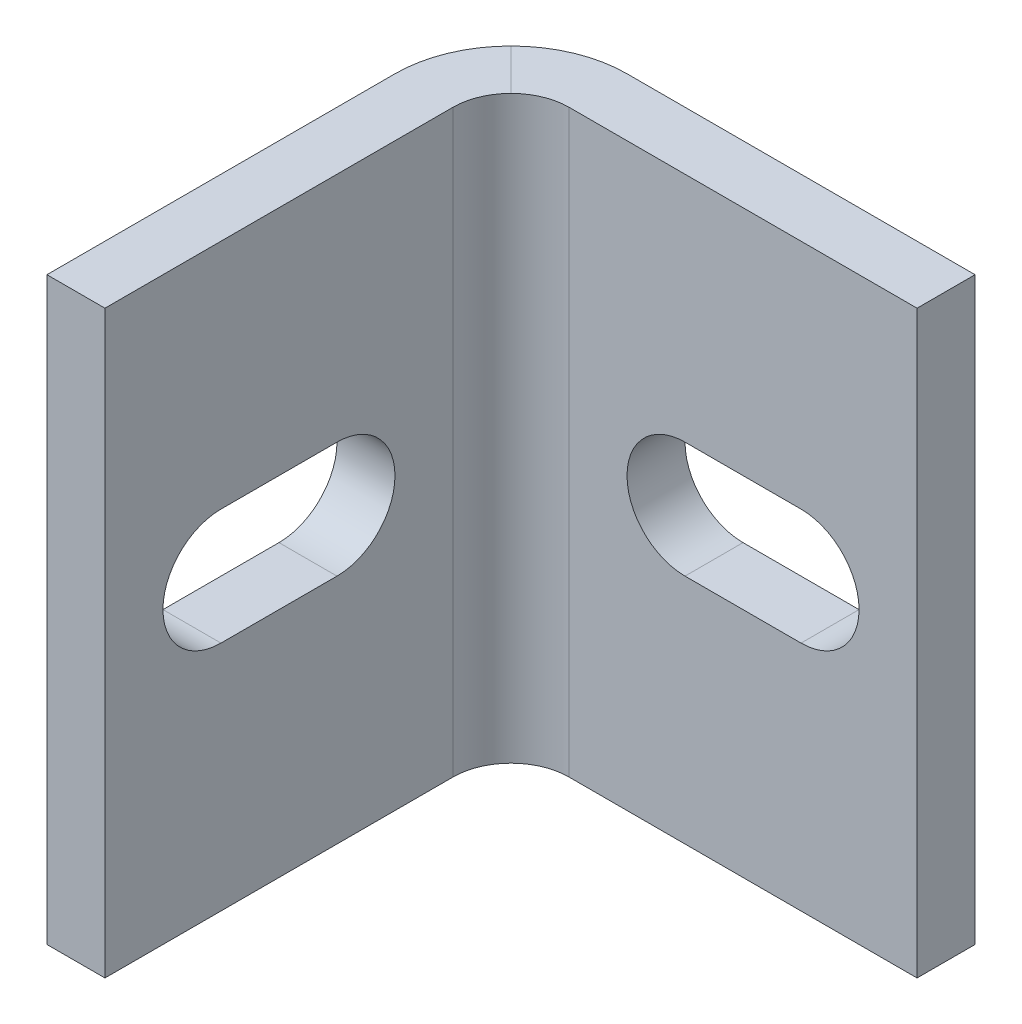
ISO-10303-21;
HEADER;
FILE_DESCRIPTION(('STEP AP214'),'2;1');
FILE_NAME('part.step','',(''),(''),'','','');
FILE_SCHEMA(('AUTOMOTIVE_DESIGN { 1 0 10303 214 1 1 1 1 }'));
ENDSEC;
DATA;
#1=APPLICATION_CONTEXT('core data for automotive mechanical design processes');
#2=APPLICATION_PROTOCOL_DEFINITION('international standard','automotive_design',2000,#1);
#3=PRODUCT_CONTEXT('',#1,'mechanical');
#4=PRODUCT('Part','Part','',(#3));
#5=PRODUCT_RELATED_PRODUCT_CATEGORY('part','',(#4));
#6=PRODUCT_DEFINITION_FORMATION('','',#4);
#7=PRODUCT_DEFINITION_CONTEXT('part definition',#1,'design');
#8=PRODUCT_DEFINITION('design','',#6,#7);
#9=PRODUCT_DEFINITION_SHAPE('','',#8);
#10=(LENGTH_UNIT() NAMED_UNIT(*) SI_UNIT(.MILLI.,.METRE.));
#11=(NAMED_UNIT(*) PLANE_ANGLE_UNIT() SI_UNIT($,.RADIAN.));
#12=(NAMED_UNIT(*) SI_UNIT($,.STERADIAN.) SOLID_ANGLE_UNIT());
#13=UNCERTAINTY_MEASURE_WITH_UNIT(LENGTH_MEASURE(1.E-05),#10,'distance_accuracy_value','');
#14=(GEOMETRIC_REPRESENTATION_CONTEXT(3) GLOBAL_UNCERTAINTY_ASSIGNED_CONTEXT((#13)) GLOBAL_UNIT_ASSIGNED_CONTEXT((#10,
#11,#12)) REPRESENTATION_CONTEXT('',''));
#15=CARTESIAN_POINT('',(0.,0.,0.));
#16=DIRECTION('',(0.,0.,1.));
#17=DIRECTION('',(1.,0.,0.));
#18=AXIS2_PLACEMENT_3D('',#15,#16,#17);
#19=CARTESIAN_POINT('',(0.,-15.875,0.));
#20=DIRECTION('',(1.,0.,0.));
#21=DIRECTION('',(0.,1.,0.));
#22=AXIS2_PLACEMENT_3D('',#19,#20,#21);
#23=PLANE('',#22);
#24=DIRECTION('',(0.,0.,-1.));
#25=VECTOR('',#24,1.);
#26=CARTESIAN_POINT('',(0.,15.875,0.));
#27=LINE('',#26,#25);
#28=CARTESIAN_POINT('',(0.,15.875,0.));
#29=VERTEX_POINT('',#28);
#30=CARTESIAN_POINT('',(-3.6949610038306E-13,15.875,-19.05));
#31=VERTEX_POINT('',#30);
#32=EDGE_CURVE('E236',#29,#31,#27,.T.);
#33=ORIENTED_EDGE('',*,*,#32,.T.);
#34=DIRECTION('',(0.,-1.,0.));
#35=VECTOR('',#34,1.);
#36=CARTESIAN_POINT('',(-3.64291929955129E-13,-15.875,-19.05));
#37=LINE('',#36,#35);
#38=CARTESIAN_POINT('',(-3.64291929955129E-13,-15.875,-19.05));
#39=VERTEX_POINT('',#38);
#40=EDGE_CURVE('E291',#31,#39,#37,.T.);
#41=ORIENTED_EDGE('',*,*,#40,.T.);
#42=DIRECTION('',(0.,0.,-1.));
#43=VECTOR('',#42,1.);
#44=CARTESIAN_POINT('',(0.,-15.875,0.));
#45=LINE('',#44,#43);
#46=CARTESIAN_POINT('',(0.,-15.875,0.));
#47=VERTEX_POINT('',#46);
#48=EDGE_CURVE('E233',#47,#39,#45,.T.);
#49=ORIENTED_EDGE('',*,*,#48,.F.);
#50=DIRECTION('',(0.,-1.,0.));
#51=VECTOR('',#50,1.);
#52=CARTESIAN_POINT('',(0.,-15.875,0.));
#53=LINE('',#52,#51);
#54=EDGE_CURVE('E231',#29,#47,#53,.T.);
#55=ORIENTED_EDGE('',*,*,#54,.F.);
#56=EDGE_LOOP('',(#33,#41,#49,#55));
#57=FACE_BOUND('',#56,.T.);
#58=CARTESIAN_POINT('',(-2.18575157973078E-13,0.,-12.7));
#59=DIRECTION('',(1.,0.,0.));
#60=DIRECTION('',(0.,0.,-1.));
#61=AXIS2_PLACEMENT_3D('',#58,#59,#60);
#62=CIRCLE('',#61,3.175);
#63=CARTESIAN_POINT('',(-2.32452945780892E-13,-3.17500000000001,-12.7));
#64=VERTEX_POINT('',#63);
#65=CARTESIAN_POINT('',(-2.18575157973078E-13,3.17499999999998,-12.7));
#66=VERTEX_POINT('',#65);
#67=EDGE_CURVE('E203',#64,#66,#62,.T.);
#68=ORIENTED_EDGE('',*,*,#67,.T.);
#69=DIRECTION('',(0.,0.,1.));
#70=VECTOR('',#69,1.);
#71=CARTESIAN_POINT('',(-2.18575157973078E-13,3.17499999999998,-12.7));
#72=LINE('',#71,#70);
#73=CARTESIAN_POINT('',(-1.21430643318376E-13,3.17499999999998,-6.35));
#74=VERTEX_POINT('',#73);
#75=EDGE_CURVE('E206',#66,#74,#72,.T.);
#76=ORIENTED_EDGE('',*,*,#75,.T.);
#77=CARTESIAN_POINT('',(-1.33573707650214E-13,0.,-6.35));
#78=DIRECTION('',(1.,0.,0.));
#79=DIRECTION('',(0.,0.,-1.));
#80=AXIS2_PLACEMENT_3D('',#77,#78,#79);
#81=CIRCLE('',#80,3.175);
#82=CARTESIAN_POINT('',(0.,-3.17500000000001,-6.35));
#83=VERTEX_POINT('',#82);
#84=EDGE_CURVE('E209',#74,#83,#81,.T.);
#85=ORIENTED_EDGE('',*,*,#84,.T.);
#86=DIRECTION('',(0.,0.,-1.));
#87=VECTOR('',#86,1.);
#88=CARTESIAN_POINT('',(-2.30718222304915E-13,-3.17500000000001,-12.7));
#89=LINE('',#88,#87);
#90=EDGE_CURVE('E212',#83,#64,#89,.T.);
#91=ORIENTED_EDGE('',*,*,#90,.T.);
#92=EDGE_LOOP('',(#68,#76,#85,#91));
#93=FACE_BOUND('',#92,.T.);
#94=ADVANCED_FACE('F34',(#57,#93),#23,.F.);
#95=CARTESIAN_POINT('',(3.175,-15.875,1.94289029309402E-13));
#96=DIRECTION('',(-1.,0.,0.));
#97=DIRECTION('',(0.,-1.,0.));
#98=AXIS2_PLACEMENT_3D('',#95,#96,#97);
#99=PLANE('',#98);
#100=DIRECTION('',(0.,0.,-1.));
#101=VECTOR('',#100,1.);
#102=CARTESIAN_POINT('',(3.175,-15.875,1.94289029309402E-13));
#103=LINE('',#102,#101);
#104=CARTESIAN_POINT('',(3.175,-15.875,1.94289029309402E-13));
#105=VERTEX_POINT('',#104);
#106=CARTESIAN_POINT('',(3.17499999999964,-15.875,-19.0499999999999));
#107=VERTEX_POINT('',#106);
#108=EDGE_CURVE('E232',#105,#107,#103,.T.);
#109=ORIENTED_EDGE('',*,*,#108,.T.);
#110=DIRECTION('',(0.,-1.,0.));
#111=VECTOR('',#110,1.);
#112=CARTESIAN_POINT('',(3.17499999999963,15.875,-19.0499999999999));
#113=LINE('',#112,#111);
#114=CARTESIAN_POINT('',(3.17499999999963,15.875,-19.0499999999999));
#115=VERTEX_POINT('',#114);
#116=EDGE_CURVE('E279',#107,#115,#113,.F.);
#117=ORIENTED_EDGE('',*,*,#116,.T.);
#118=DIRECTION('',(0.,0.,-1.));
#119=VECTOR('',#118,1.);
#120=CARTESIAN_POINT('',(3.17500000000001,15.875,1.94289029309402E-13));
#121=LINE('',#120,#119);
#122=CARTESIAN_POINT('',(3.17500000000001,15.875,1.94289029309402E-13));
#123=VERTEX_POINT('',#122);
#124=EDGE_CURVE('E243',#123,#115,#121,.T.);
#125=ORIENTED_EDGE('',*,*,#124,.F.);
#126=DIRECTION('',(0.,1.,0.));
#127=VECTOR('',#126,1.);
#128=CARTESIAN_POINT('',(3.175,-15.875,1.94289029309402E-13));
#129=LINE('',#128,#127);
#130=EDGE_CURVE('E246',#105,#123,#129,.T.);
#131=ORIENTED_EDGE('',*,*,#130,.F.);
#132=EDGE_LOOP('',(#109,#117,#125,#131));
#133=FACE_BOUND('',#132,.T.);
#134=CARTESIAN_POINT('',(3.17499999999978,0.,-12.7));
#135=DIRECTION('',(-1.,0.,0.));
#136=DIRECTION('',(0.,-1.,0.));
#137=AXIS2_PLACEMENT_3D('',#134,#135,#136);
#138=CIRCLE('',#137,3.175);
#139=CARTESIAN_POINT('',(3.17499999999973,3.17500000000001,-12.7));
#140=VERTEX_POINT('',#139);
#141=CARTESIAN_POINT('',(3.17499999999977,-3.17500000000001,-12.7));
#142=VERTEX_POINT('',#141);
#143=EDGE_CURVE('E200',#140,#142,#138,.T.);
#144=ORIENTED_EDGE('',*,*,#143,.T.);
#145=DIRECTION('',(0.,0.,1.));
#146=VECTOR('',#145,1.);
#147=CARTESIAN_POINT('',(3.17499999999977,-3.17500000000001,-12.7));
#148=LINE('',#147,#146);
#149=CARTESIAN_POINT('',(3.1749999999999,-3.17500000000001,-6.34999999999981));
#150=VERTEX_POINT('',#149);
#151=EDGE_CURVE('E224',#142,#150,#148,.T.);
#152=ORIENTED_EDGE('',*,*,#151,.T.);
#153=CARTESIAN_POINT('',(3.1749999999999,0.,-6.34999999999981));
#154=DIRECTION('',(-1.,0.,0.));
#155=DIRECTION('',(0.,-1.,0.));
#156=AXIS2_PLACEMENT_3D('',#153,#154,#155);
#157=CIRCLE('',#156,3.175);
#158=CARTESIAN_POINT('',(3.17499999999988,3.17499999999998,-6.34999999999981));
#159=VERTEX_POINT('',#158);
#160=EDGE_CURVE('E191',#150,#159,#157,.T.);
#161=ORIENTED_EDGE('',*,*,#160,.T.);
#162=DIRECTION('',(0.,0.,-1.));
#163=VECTOR('',#162,1.);
#164=CARTESIAN_POINT('',(3.17499999999973,3.17500000000001,-12.7));
#165=LINE('',#164,#163);
#166=EDGE_CURVE('E197',#159,#140,#165,.T.);
#167=ORIENTED_EDGE('',*,*,#166,.T.);
#168=EDGE_LOOP('',(#144,#152,#161,#167));
#169=FACE_BOUND('',#168,.T.);
#170=ADVANCED_FACE('F342',(#133,#169),#99,.F.);
#171=CARTESIAN_POINT('',(25.3999999999996,0.,-25.3999999999994));
#172=DIRECTION('',(-1.,0.,0.));
#173=DIRECTION('',(0.,0.,1.));
#174=AXIS2_PLACEMENT_3D('',#171,#172,#173);
#175=PLANE('',#174);
#176=DIRECTION('',(0.,1.,0.));
#177=VECTOR('',#176,1.);
#178=CARTESIAN_POINT('',(25.3999999999996,-15.875,-22.2249999999994));
#179=LINE('',#178,#177);
#180=CARTESIAN_POINT('',(25.3999999999996,-15.875,-22.2249999999994));
#181=VERTEX_POINT('',#180);
#182=CARTESIAN_POINT('',(25.3999999999996,15.875,-22.2249999999994));
#183=VERTEX_POINT('',#182);
#184=EDGE_CURVE('E272',#181,#183,#179,.T.);
#185=ORIENTED_EDGE('',*,*,#184,.F.);
#186=DIRECTION('',(0.,0.,1.));
#187=VECTOR('',#186,1.);
#188=CARTESIAN_POINT('',(25.3999999999996,-15.875,-22.2249999999994));
#189=LINE('',#188,#187);
#190=CARTESIAN_POINT('',(25.3999999999996,-15.875,-25.3999999999994));
#191=VERTEX_POINT('',#190);
#192=EDGE_CURVE('E227',#191,#181,#189,.T.);
#193=ORIENTED_EDGE('',*,*,#192,.F.);
#194=DIRECTION('',(0.,-1.,0.));
#195=VECTOR('',#194,1.);
#196=CARTESIAN_POINT('',(25.3999999999996,-15.875,-25.3999999999994));
#197=LINE('',#196,#195);
#198=CARTESIAN_POINT('',(25.3999999999995,15.875,-25.3999999999994));
#199=VERTEX_POINT('',#198);
#200=EDGE_CURVE('E263',#199,#191,#197,.T.);
#201=ORIENTED_EDGE('',*,*,#200,.F.);
#202=DIRECTION('',(0.,0.,-1.));
#203=VECTOR('',#202,1.);
#204=CARTESIAN_POINT('',(25.3999999999996,15.875,-22.2249999999994));
#205=LINE('',#204,#203);
#206=EDGE_CURVE('E268',#183,#199,#205,.T.);
#207=ORIENTED_EDGE('',*,*,#206,.F.);
#208=EDGE_LOOP('',(#185,#193,#201,#207));
#209=FACE_BOUND('',#208,.T.);
#210=ADVANCED_FACE('F338',(#209),#175,.F.);
#211=CARTESIAN_POINT('',(0.,0.,0.));
#212=DIRECTION('',(0.,0.,1.));
#213=DIRECTION('',(1.,0.,0.));
#214=AXIS2_PLACEMENT_3D('',#211,#212,#213);
#215=PLANE('',#214);
#216=ORIENTED_EDGE('',*,*,#130,.T.);
#217=DIRECTION('',(-1.,0.,0.));
#218=VECTOR('',#217,1.);
#219=CARTESIAN_POINT('',(3.17500000000001,15.875,1.94289029309402E-13));
#220=LINE('',#219,#218);
#221=EDGE_CURVE('E240',#123,#29,#220,.T.);
#222=ORIENTED_EDGE('',*,*,#221,.T.);
#223=ORIENTED_EDGE('',*,*,#54,.T.);
#224=DIRECTION('',(1.,0.,0.));
#225=VECTOR('',#224,1.);
#226=CARTESIAN_POINT('',(3.175,-15.875,1.94289029309402E-13));
#227=LINE('',#226,#225);
#228=EDGE_CURVE('E228',#47,#105,#227,.T.);
#229=ORIENTED_EDGE('',*,*,#228,.T.);
#230=EDGE_LOOP('',(#216,#222,#223,#229));
#231=FACE_BOUND('',#230,.T.);
#232=ADVANCED_FACE('F321',(#231),#215,.T.);
#233=CARTESIAN_POINT('',(-3.88578058618805E-13,-15.875,-22.225));
#234=DIRECTION('',(0.,0.,-1.));
#235=DIRECTION('',(0.,1.,0.));
#236=AXIS2_PLACEMENT_3D('',#233,#234,#235);
#237=PLANE('',#236);
#238=DIRECTION('',(1.,0.,0.));
#239=VECTOR('',#238,1.);
#240=CARTESIAN_POINT('',(12.6999999999996,-3.17500000000001,-22.2249999999997));
#241=LINE('',#240,#239);
#242=CARTESIAN_POINT('',(12.6999999999996,-3.17500000000001,-22.2249999999997));
#243=VERTEX_POINT('',#242);
#244=CARTESIAN_POINT('',(19.0499999999996,-3.17499999999998,-22.2249999999996));
#245=VERTEX_POINT('',#244);
#246=EDGE_CURVE('E185',#243,#245,#241,.T.);
#247=ORIENTED_EDGE('',*,*,#246,.F.);
#248=CARTESIAN_POINT('',(12.6999999999996,0.,-22.2249999999997));
#249=DIRECTION('',(0.,0.,1.));
#250=DIRECTION('',(1.,0.,0.));
#251=AXIS2_PLACEMENT_3D('',#248,#249,#250);
#252=CIRCLE('',#251,3.175);
#253=CARTESIAN_POINT('',(12.6999999999996,3.17499999999998,-22.2249999999997));
#254=VERTEX_POINT('',#253);
#255=EDGE_CURVE('E49',#254,#243,#252,.T.);
#256=ORIENTED_EDGE('',*,*,#255,.F.);
#257=DIRECTION('',(-1.,0.,0.));
#258=VECTOR('',#257,1.);
#259=CARTESIAN_POINT('',(12.6999999999996,3.17499999999998,-22.2249999999997));
#260=LINE('',#259,#258);
#261=CARTESIAN_POINT('',(19.0499999999996,3.17499999999998,-22.2249999999996));
#262=VERTEX_POINT('',#261);
#263=EDGE_CURVE('E176',#262,#254,#260,.T.);
#264=ORIENTED_EDGE('',*,*,#263,.F.);
#265=CARTESIAN_POINT('',(19.0499999999996,0.,-22.2249999999996));
#266=DIRECTION('',(0.,0.,1.));
#267=DIRECTION('',(1.,0.,0.));
#268=AXIS2_PLACEMENT_3D('',#265,#266,#267);
#269=CIRCLE('',#268,3.175);
#270=EDGE_CURVE('E179',#245,#262,#269,.T.);
#271=ORIENTED_EDGE('',*,*,#270,.F.);
#272=EDGE_LOOP('',(#247,#256,#264,#271));
#273=FACE_BOUND('',#272,.T.);
#274=DIRECTION('',(1.,0.,0.));
#275=VECTOR('',#274,1.);
#276=CARTESIAN_POINT('',(-4.25007251614318E-13,15.875,-22.225));
#277=LINE('',#276,#275);
#278=CARTESIAN_POINT('',(6.34999999999959,15.875,-22.2249999999999));
#279=VERTEX_POINT('',#278);
#280=EDGE_CURVE('E271',#279,#183,#277,.T.);
#281=ORIENTED_EDGE('',*,*,#280,.F.);
#282=DIRECTION('',(0.,-1.,0.));
#283=VECTOR('',#282,1.);
#284=CARTESIAN_POINT('',(6.34999999999959,-15.875,-22.2249999999999));
#285=LINE('',#284,#283);
#286=CARTESIAN_POINT('',(6.34999999999959,-15.875,-22.2249999999999));
#287=VERTEX_POINT('',#286);
#288=EDGE_CURVE('E249',#279,#287,#285,.T.);
#289=ORIENTED_EDGE('',*,*,#288,.T.);
#290=DIRECTION('',(1.,0.,0.));
#291=VECTOR('',#290,1.);
#292=CARTESIAN_POINT('',(-3.88578058618805E-13,-15.875,-22.225));
#293=LINE('',#292,#291);
#294=EDGE_CURVE('E254',#287,#181,#293,.T.);
#295=ORIENTED_EDGE('',*,*,#294,.T.);
#296=ORIENTED_EDGE('',*,*,#184,.T.);
#297=EDGE_LOOP('',(#281,#289,#295,#296));
#298=FACE_BOUND('',#297,.T.);
#299=ADVANCED_FACE('F331',(#273,#298),#237,.F.);
#300=CARTESIAN_POINT('',(-4.25007251614318E-13,15.875,-22.225));
#301=DIRECTION('',(0.,-1.,0.));
#302=DIRECTION('',(0.,0.,-1.));
#303=AXIS2_PLACEMENT_3D('',#300,#301,#302);
#304=PLANE('',#303);
#305=DIRECTION('',(1.,0.,0.));
#306=VECTOR('',#305,1.);
#307=CARTESIAN_POINT('',(-4.97865637605344E-13,15.875,-25.4));
#308=LINE('',#307,#306);
#309=CARTESIAN_POINT('',(6.34999999999952,15.875,-25.3999999999999));
#310=VERTEX_POINT('',#309);
#311=EDGE_CURVE('E266',#310,#199,#308,.T.);
#312=ORIENTED_EDGE('',*,*,#311,.F.);
#313=CARTESIAN_POINT('',(6.34999999999964,15.875,-19.0499999999999));
#314=DIRECTION('',(0.,-1.,0.));
#315=DIRECTION('',(0.,0.,-1.));
#316=AXIS2_PLACEMENT_3D('',#313,#314,#315);
#317=CIRCLE('',#316,6.35);
#318=CARTESIAN_POINT('',(1.85987193946495,15.875,-23.5401280605345));
#319=VERTEX_POINT('',#318);
#320=EDGE_CURVE('E42',#310,#319,#317,.F.);
#321=ORIENTED_EDGE('',*,*,#320,.T.);
#322=DIRECTION('',(0.70710678118656,0.,0.70710678118656));
#323=VECTOR('',#322,1.);
#324=CARTESIAN_POINT('',(14.2874999999998,15.875,-11.1124999999998));
#325=LINE('',#324,#323);
#326=CARTESIAN_POINT('',(4.10493596973232,15.875,-21.2950640302671));
#327=VERTEX_POINT('',#326);
#328=EDGE_CURVE('E237',#319,#327,#325,.T.);
#329=ORIENTED_EDGE('',*,*,#328,.T.);
#330=CARTESIAN_POINT('',(6.34999999999964,15.875,-19.0499999999999));
#331=DIRECTION('',(0.,-1.,0.));
#332=DIRECTION('',(0.,0.,-1.));
#333=AXIS2_PLACEMENT_3D('',#330,#331,#332);
#334=CIRCLE('',#333,3.175);
#335=EDGE_CURVE('E289',#327,#279,#334,.T.);
#336=ORIENTED_EDGE('',*,*,#335,.T.);
#337=ORIENTED_EDGE('',*,*,#280,.T.);
#338=ORIENTED_EDGE('',*,*,#206,.T.);
#339=EDGE_LOOP('',(#312,#321,#329,#336,#337,#338));
#340=FACE_BOUND('',#339,.T.);
#341=ADVANCED_FACE('F303',(#340),#304,.F.);
#342=CARTESIAN_POINT('',(-4.61436444609831E-13,-15.875,-25.4));
#343=DIRECTION('',(0.,0.,1.));
#344=DIRECTION('',(0.,-1.,0.));
#345=AXIS2_PLACEMENT_3D('',#342,#343,#344);
#346=PLANE('',#345);
#347=DIRECTION('',(-1.,0.,0.));
#348=VECTOR('',#347,1.);
#349=CARTESIAN_POINT('',(12.6999999999996,3.17499999999998,-25.3999999999997));
#350=LINE('',#349,#348);
#351=CARTESIAN_POINT('',(19.0499999999996,3.17499999999998,-25.3999999999996));
#352=VERTEX_POINT('',#351);
#353=CARTESIAN_POINT('',(12.6999999999996,3.17499999999998,-25.3999999999997));
#354=VERTEX_POINT('',#353);
#355=EDGE_CURVE('E166',#352,#354,#350,.T.);
#356=ORIENTED_EDGE('',*,*,#355,.T.);
#357=CARTESIAN_POINT('',(12.6999999999995,0.,-25.3999999999997));
#358=DIRECTION('',(0.,0.,1.));
#359=DIRECTION('',(1.,0.,0.));
#360=AXIS2_PLACEMENT_3D('',#357,#358,#359);
#361=CIRCLE('',#360,3.175);
#362=CARTESIAN_POINT('',(12.6999999999995,-3.17500000000001,-25.3999999999997));
#363=VERTEX_POINT('',#362);
#364=EDGE_CURVE('E160',#354,#363,#361,.T.);
#365=ORIENTED_EDGE('',*,*,#364,.T.);
#366=DIRECTION('',(1.,0.,0.));
#367=VECTOR('',#366,1.);
#368=CARTESIAN_POINT('',(12.6999999999995,-3.17500000000001,-25.3999999999997));
#369=LINE('',#368,#367);
#370=CARTESIAN_POINT('',(19.0499999999995,-3.17500000000001,-25.3999999999996));
#371=VERTEX_POINT('',#370);
#372=EDGE_CURVE('E169',#363,#371,#369,.T.);
#373=ORIENTED_EDGE('',*,*,#372,.T.);
#374=CARTESIAN_POINT('',(19.0499999999996,0.,-25.3999999999996));
#375=DIRECTION('',(0.,0.,1.));
#376=DIRECTION('',(1.,0.,0.));
#377=AXIS2_PLACEMENT_3D('',#374,#375,#376);
#378=CIRCLE('',#377,3.175);
#379=EDGE_CURVE('E57',#371,#352,#378,.T.);
#380=ORIENTED_EDGE('',*,*,#379,.T.);
#381=EDGE_LOOP('',(#356,#365,#373,#380));
#382=FACE_BOUND('',#381,.T.);
#383=DIRECTION('',(1.,0.,0.));
#384=VECTOR('',#383,1.);
#385=CARTESIAN_POINT('',(-4.61436444609831E-13,-15.875,-25.4));
#386=LINE('',#385,#384);
#387=CARTESIAN_POINT('',(6.34999999999952,-15.875,-25.3999999999999));
#388=VERTEX_POINT('',#387);
#389=EDGE_CURVE('E261',#388,#191,#386,.T.);
#390=ORIENTED_EDGE('',*,*,#389,.F.);
#391=DIRECTION('',(0.,-1.,0.));
#392=VECTOR('',#391,1.);
#393=CARTESIAN_POINT('',(6.34999999999952,-15.875,-25.3999999999999));
#394=LINE('',#393,#392);
#395=EDGE_CURVE('E298',#388,#310,#394,.F.);
#396=ORIENTED_EDGE('',*,*,#395,.T.);
#397=ORIENTED_EDGE('',*,*,#311,.T.);
#398=ORIENTED_EDGE('',*,*,#200,.T.);
#399=EDGE_LOOP('',(#390,#396,#397,#398));
#400=FACE_BOUND('',#399,.T.);
#401=ADVANCED_FACE('F173',(#382,#400),#346,.F.);
#402=CARTESIAN_POINT('',(-3.88578058618805E-13,-15.875,-22.225));
#403=DIRECTION('',(0.,1.,0.));
#404=DIRECTION('',(0.,0.,1.));
#405=AXIS2_PLACEMENT_3D('',#402,#403,#404);
#406=PLANE('',#405);
#407=DIRECTION('',(-0.70710678118656,0.,-0.70710678118656));
#408=VECTOR('',#407,1.);
#409=CARTESIAN_POINT('',(14.2874999999998,-15.875,-11.1124999999998));
#410=LINE('',#409,#408);
#411=CARTESIAN_POINT('',(4.10493596973231,-15.875,-21.2950640302671));
#412=VERTEX_POINT('',#411);
#413=CARTESIAN_POINT('',(1.859871939465,-15.875,-23.5401280605345));
#414=VERTEX_POINT('',#413);
#415=EDGE_CURVE('E251',#412,#414,#410,.T.);
#416=ORIENTED_EDGE('',*,*,#415,.T.);
#417=CARTESIAN_POINT('',(6.34999999999963,-15.875,-19.0499999999999));
#418=DIRECTION('',(0.,1.,0.));
#419=DIRECTION('',(0.,0.,1.));
#420=AXIS2_PLACEMENT_3D('',#417,#418,#419);
#421=CIRCLE('',#420,6.35);
#422=EDGE_CURVE('E296',#414,#388,#421,.F.);
#423=ORIENTED_EDGE('',*,*,#422,.T.);
#424=ORIENTED_EDGE('',*,*,#389,.T.);
#425=ORIENTED_EDGE('',*,*,#192,.T.);
#426=ORIENTED_EDGE('',*,*,#294,.F.);
#427=CARTESIAN_POINT('',(6.34999999999963,-15.875,-19.0499999999999));
#428=DIRECTION('',(0.,1.,0.));
#429=DIRECTION('',(0.,0.,1.));
#430=AXIS2_PLACEMENT_3D('',#427,#428,#429);
#431=CIRCLE('',#430,3.175);
#432=EDGE_CURVE('E281',#287,#412,#431,.T.);
#433=ORIENTED_EDGE('',*,*,#432,.T.);
#434=EDGE_LOOP('',(#416,#423,#424,#425,#426,#433));
#435=FACE_BOUND('',#434,.T.);
#436=ADVANCED_FACE('F341',(#435),#406,.F.);
#437=CARTESIAN_POINT('',(3.17500000000001,15.875,1.94289029309402E-13));
#438=DIRECTION('',(0.,-1.,0.));
#439=DIRECTION('',(0.,0.,-1.));
#440=AXIS2_PLACEMENT_3D('',#437,#438,#439);
#441=PLANE('',#440);
#442=ORIENTED_EDGE('',*,*,#328,.F.);
#443=CARTESIAN_POINT('',(6.34999999999964,15.875,-19.0499999999999));
#444=DIRECTION('',(0.,-1.,0.));
#445=DIRECTION('',(0.,0.,-1.));
#446=AXIS2_PLACEMENT_3D('',#443,#444,#445);
#447=CIRCLE('',#446,6.35);
#448=EDGE_CURVE('E11',#319,#31,#447,.F.);
#449=ORIENTED_EDGE('',*,*,#448,.T.);
#450=ORIENTED_EDGE('',*,*,#32,.F.);
#451=ORIENTED_EDGE('',*,*,#221,.F.);
#452=ORIENTED_EDGE('',*,*,#124,.T.);
#453=CARTESIAN_POINT('',(6.34999999999964,15.875,-19.0499999999999));
#454=DIRECTION('',(0.,-1.,0.));
#455=DIRECTION('',(0.,0.,-1.));
#456=AXIS2_PLACEMENT_3D('',#453,#454,#455);
#457=CIRCLE('',#456,3.175);
#458=EDGE_CURVE('E286',#115,#327,#457,.T.);
#459=ORIENTED_EDGE('',*,*,#458,.T.);
#460=EDGE_LOOP('',(#442,#449,#450,#451,#452,#459));
#461=FACE_BOUND('',#460,.T.);
#462=ADVANCED_FACE('F308',(#461),#441,.F.);
#463=CARTESIAN_POINT('',(3.175,-15.875,1.94289029309402E-13));
#464=DIRECTION('',(0.,1.,0.));
#465=DIRECTION('',(0.,0.,1.));
#466=AXIS2_PLACEMENT_3D('',#463,#464,#465);
#467=PLANE('',#466);
#468=ORIENTED_EDGE('',*,*,#48,.T.);
#469=CARTESIAN_POINT('',(6.34999999999963,-15.875,-19.0499999999999));
#470=DIRECTION('',(0.,1.,0.));
#471=DIRECTION('',(0.,0.,1.));
#472=AXIS2_PLACEMENT_3D('',#469,#470,#471);
#473=CIRCLE('',#472,6.35);
#474=EDGE_CURVE('E294',#39,#414,#473,.F.);
#475=ORIENTED_EDGE('',*,*,#474,.T.);
#476=ORIENTED_EDGE('',*,*,#415,.F.);
#477=CARTESIAN_POINT('',(6.34999999999963,-15.875,-19.0499999999999));
#478=DIRECTION('',(0.,1.,0.));
#479=DIRECTION('',(0.,0.,1.));
#480=AXIS2_PLACEMENT_3D('',#477,#478,#479);
#481=CIRCLE('',#480,3.175);
#482=EDGE_CURVE('E284',#412,#107,#481,.T.);
#483=ORIENTED_EDGE('',*,*,#482,.T.);
#484=ORIENTED_EDGE('',*,*,#108,.F.);
#485=ORIENTED_EDGE('',*,*,#228,.F.);
#486=EDGE_LOOP('',(#468,#475,#476,#483,#484,#485));
#487=FACE_BOUND('',#486,.T.);
#488=ADVANCED_FACE('F318',(#487),#467,.F.);
#489=CARTESIAN_POINT('',(6.34999999999963,-15.875,-19.0499999999999));
#490=DIRECTION('',(0.,1.,0.));
#491=DIRECTION('',(0.,0.,1.));
#492=AXIS2_PLACEMENT_3D('',#489,#490,#491);
#493=CYLINDRICAL_SURFACE('',#492,3.175);
#494=ORIENTED_EDGE('',*,*,#458,.F.);
#495=ORIENTED_EDGE('',*,*,#116,.F.);
#496=ORIENTED_EDGE('',*,*,#482,.F.);
#497=ORIENTED_EDGE('',*,*,#432,.F.);
#498=ORIENTED_EDGE('',*,*,#288,.F.);
#499=ORIENTED_EDGE('',*,*,#335,.F.);
#500=EDGE_LOOP('',(#494,#495,#496,#497,#498,#499));
#501=FACE_BOUND('',#500,.T.);
#502=ADVANCED_FACE('F326',(#501),#493,.F.);
#503=CARTESIAN_POINT('',(6.34999999999963,-15.875,-19.0499999999999));
#504=DIRECTION('',(0.,-1.,0.));
#505=DIRECTION('',(0.,0.,-1.));
#506=AXIS2_PLACEMENT_3D('',#503,#504,#505);
#507=CYLINDRICAL_SURFACE('',#506,6.35);
#508=ORIENTED_EDGE('',*,*,#320,.F.);
#509=ORIENTED_EDGE('',*,*,#395,.F.);
#510=ORIENTED_EDGE('',*,*,#422,.F.);
#511=ORIENTED_EDGE('',*,*,#474,.F.);
#512=ORIENTED_EDGE('',*,*,#40,.F.);
#513=ORIENTED_EDGE('',*,*,#448,.F.);
#514=EDGE_LOOP('',(#508,#509,#510,#511,#512,#513));
#515=FACE_BOUND('',#514,.T.);
#516=ADVANCED_FACE('F36',(#515),#507,.T.);
#517=CARTESIAN_POINT('',(25.4009999999998,0.,-12.6999999999994));
#518=DIRECTION('',(-1.,0.,0.));
#519=DIRECTION('',(0.,0.,1.));
#520=AXIS2_PLACEMENT_3D('',#517,#518,#519);
#521=CYLINDRICAL_SURFACE('',#520,3.175);
#522=DIRECTION('',(-1.,0.,0.));
#523=VECTOR('',#522,1.);
#524=CARTESIAN_POINT('',(25.4009999999998,3.17500000000001,-12.6999999999994));
#525=LINE('',#524,#523);
#526=EDGE_CURVE('E222',#140,#66,#525,.T.);
#527=ORIENTED_EDGE('',*,*,#526,.T.);
#528=ORIENTED_EDGE('',*,*,#67,.F.);
#529=DIRECTION('',(-1.,0.,0.));
#530=VECTOR('',#529,1.);
#531=CARTESIAN_POINT('',(25.4009999999997,-3.17499999999998,-12.6999999999994));
#532=LINE('',#531,#530);
#533=EDGE_CURVE('E215',#142,#64,#532,.T.);
#534=ORIENTED_EDGE('',*,*,#533,.F.);
#535=ORIENTED_EDGE('',*,*,#143,.F.);
#536=EDGE_LOOP('',(#527,#528,#534,#535));
#537=FACE_BOUND('',#536,.T.);
#538=ADVANCED_FACE('F349',(#537),#521,.F.);
#539=CARTESIAN_POINT('',(25.4009999999998,3.17500000000001,-12.6999999999994));
#540=DIRECTION('',(0.,-1.,0.));
#541=DIRECTION('',(0.,0.,-1.));
#542=AXIS2_PLACEMENT_3D('',#539,#540,#541);
#543=PLANE('',#542);
#544=DIRECTION('',(-1.,0.,0.));
#545=VECTOR('',#544,1.);
#546=CARTESIAN_POINT('',(25.4009999999999,3.17500000000001,-6.34999999999942));
#547=LINE('',#546,#545);
#548=EDGE_CURVE('E220',#159,#74,#547,.T.);
#549=ORIENTED_EDGE('',*,*,#548,.T.);
#550=ORIENTED_EDGE('',*,*,#75,.F.);
#551=ORIENTED_EDGE('',*,*,#526,.F.);
#552=ORIENTED_EDGE('',*,*,#166,.F.);
#553=EDGE_LOOP('',(#549,#550,#551,#552));
#554=FACE_BOUND('',#553,.T.);
#555=ADVANCED_FACE('F352',(#554),#543,.T.);
#556=CARTESIAN_POINT('',(25.4009999999999,0.,-6.34999999999942));
#557=DIRECTION('',(-1.,0.,0.));
#558=DIRECTION('',(0.,0.,1.));
#559=AXIS2_PLACEMENT_3D('',#556,#557,#558);
#560=CYLINDRICAL_SURFACE('',#559,3.175);
#561=DIRECTION('',(-1.,0.,0.));
#562=VECTOR('',#561,1.);
#563=CARTESIAN_POINT('',(25.4009999999998,-3.17500000000001,-6.34999999999942));
#564=LINE('',#563,#562);
#565=EDGE_CURVE('E218',#150,#83,#564,.T.);
#566=ORIENTED_EDGE('',*,*,#565,.T.);
#567=ORIENTED_EDGE('',*,*,#84,.F.);
#568=ORIENTED_EDGE('',*,*,#548,.F.);
#569=ORIENTED_EDGE('',*,*,#160,.F.);
#570=EDGE_LOOP('',(#566,#567,#568,#569));
#571=FACE_BOUND('',#570,.T.);
#572=ADVANCED_FACE('F360',(#571),#560,.F.);
#573=CARTESIAN_POINT('',(25.4009999999997,-3.17499999999998,-12.6999999999994));
#574=DIRECTION('',(0.,1.,0.));
#575=DIRECTION('',(0.,0.,1.));
#576=AXIS2_PLACEMENT_3D('',#573,#574,#575);
#577=PLANE('',#576);
#578=ORIENTED_EDGE('',*,*,#533,.T.);
#579=ORIENTED_EDGE('',*,*,#90,.F.);
#580=ORIENTED_EDGE('',*,*,#565,.F.);
#581=ORIENTED_EDGE('',*,*,#151,.F.);
#582=EDGE_LOOP('',(#578,#579,#580,#581));
#583=FACE_BOUND('',#582,.T.);
#584=ADVANCED_FACE('F357',(#583),#577,.T.);
#585=CARTESIAN_POINT('',(12.6999999999995,0.,-25.3999999999997));
#586=DIRECTION('',(0.,0.,1.));
#587=DIRECTION('',(1.,0.,0.));
#588=AXIS2_PLACEMENT_3D('',#585,#586,#587);
#589=CYLINDRICAL_SURFACE('',#588,3.175);
#590=ORIENTED_EDGE('',*,*,#255,.T.);
#591=DIRECTION('',(0.,0.,1.));
#592=VECTOR('',#591,1.);
#593=CARTESIAN_POINT('',(12.6999999999995,-3.17500000000001,-25.3999999999997));
#594=LINE('',#593,#592);
#595=EDGE_CURVE('E156',#363,#243,#594,.T.);
#596=ORIENTED_EDGE('',*,*,#595,.F.);
#597=ORIENTED_EDGE('',*,*,#364,.F.);
#598=DIRECTION('',(0.,0.,1.));
#599=VECTOR('',#598,1.);
#600=CARTESIAN_POINT('',(12.6999999999996,3.17499999999998,-25.3999999999997));
#601=LINE('',#600,#599);
#602=EDGE_CURVE('E189',#354,#254,#601,.T.);
#603=ORIENTED_EDGE('',*,*,#602,.T.);
#604=EDGE_LOOP('',(#590,#596,#597,#603));
#605=FACE_BOUND('',#604,.T.);
#606=ADVANCED_FACE('F158',(#605),#589,.F.);
#607=CARTESIAN_POINT('',(12.6999999999996,3.17499999999998,-25.3999999999997));
#608=DIRECTION('',(0.,1.,0.));
#609=DIRECTION('',(-1.,0.,0.));
#610=AXIS2_PLACEMENT_3D('',#607,#608,#609);
#611=PLANE('',#610);
#612=ORIENTED_EDGE('',*,*,#263,.T.);
#613=ORIENTED_EDGE('',*,*,#602,.F.);
#614=ORIENTED_EDGE('',*,*,#355,.F.);
#615=DIRECTION('',(0.,0.,1.));
#616=VECTOR('',#615,1.);
#617=CARTESIAN_POINT('',(19.0499999999996,3.17499999999998,-25.3999999999996));
#618=LINE('',#617,#616);
#619=EDGE_CURVE('E192',#352,#262,#618,.T.);
#620=ORIENTED_EDGE('',*,*,#619,.T.);
#621=EDGE_LOOP('',(#612,#613,#614,#620));
#622=FACE_BOUND('',#621,.T.);
#623=ADVANCED_FACE('F423',(#622),#611,.F.);
#624=CARTESIAN_POINT('',(19.0499999999996,0.,-25.3999999999996));
#625=DIRECTION('',(0.,0.,1.));
#626=DIRECTION('',(1.,0.,0.));
#627=AXIS2_PLACEMENT_3D('',#624,#625,#626);
#628=CYLINDRICAL_SURFACE('',#627,3.175);
#629=ORIENTED_EDGE('',*,*,#270,.T.);
#630=ORIENTED_EDGE('',*,*,#619,.F.);
#631=ORIENTED_EDGE('',*,*,#379,.F.);
#632=DIRECTION('',(0.,0.,1.));
#633=VECTOR('',#632,1.);
#634=CARTESIAN_POINT('',(19.0499999999995,-3.17499999999998,-25.3999999999996));
#635=LINE('',#634,#633);
#636=EDGE_CURVE('E165',#371,#245,#635,.T.);
#637=ORIENTED_EDGE('',*,*,#636,.T.);
#638=EDGE_LOOP('',(#629,#630,#631,#637));
#639=FACE_BOUND('',#638,.T.);
#640=ADVANCED_FACE('F432',(#639),#628,.F.);
#641=CARTESIAN_POINT('',(12.6999999999995,-3.17500000000001,-25.3999999999997));
#642=DIRECTION('',(0.,-1.,0.));
#643=DIRECTION('',(1.,0.,0.));
#644=AXIS2_PLACEMENT_3D('',#641,#642,#643);
#645=PLANE('',#644);
#646=ORIENTED_EDGE('',*,*,#246,.T.);
#647=ORIENTED_EDGE('',*,*,#636,.F.);
#648=ORIENTED_EDGE('',*,*,#372,.F.);
#649=ORIENTED_EDGE('',*,*,#595,.T.);
#650=EDGE_LOOP('',(#646,#647,#648,#649));
#651=FACE_BOUND('',#650,.T.);
#652=ADVANCED_FACE('F170',(#651),#645,.F.);
#653=CLOSED_SHELL('',(#94,#170,#210,#232,#299,#341,#401,#436,#462,#488,#502,#516,#538,#555,#572,
#584,#606,#623,#640,#652));
#654=MANIFOLD_SOLID_BREP('B2',#653);
#655=ADVANCED_BREP_SHAPE_REPRESENTATION('',(#18,#654),#14);
#656=SHAPE_DEFINITION_REPRESENTATION(#9,#655);
ENDSEC;
END-ISO-10303-21;
